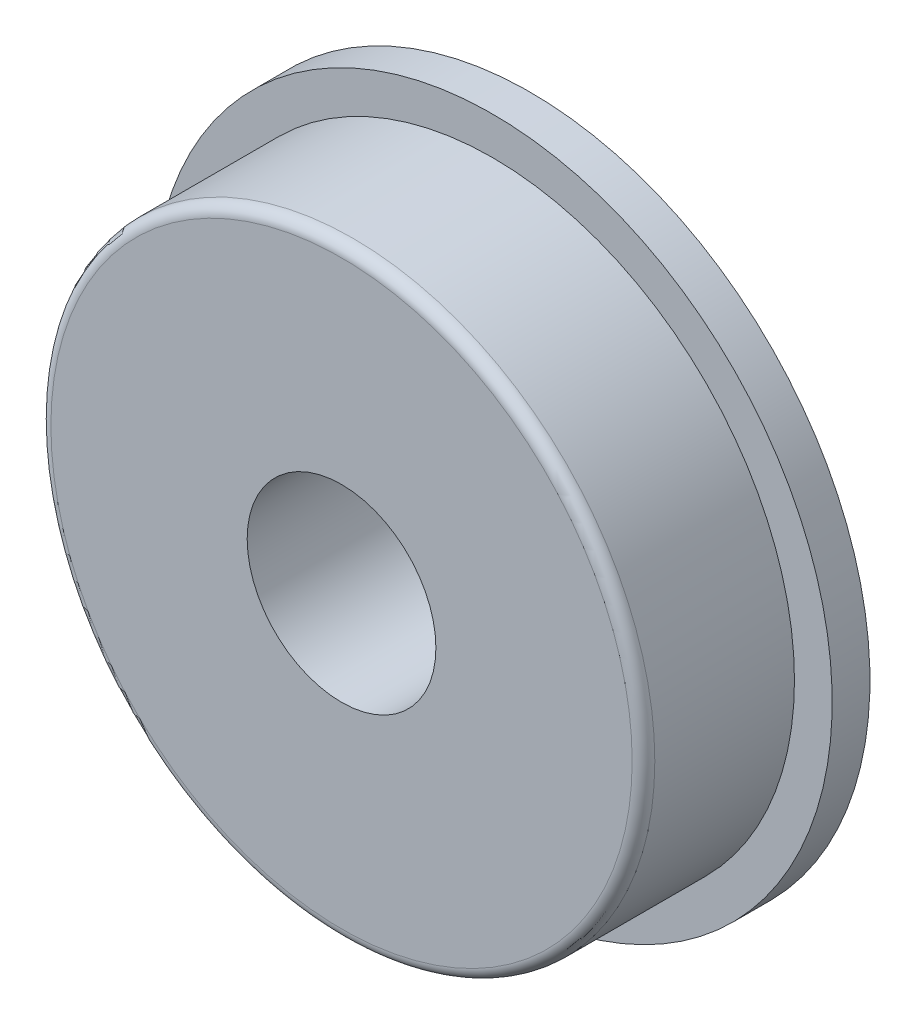
ISO-10303-21;
HEADER;
FILE_DESCRIPTION(('STEP AP214'),'2;1');
FILE_NAME('part.step','',(''),(''),'','','');
FILE_SCHEMA(('AUTOMOTIVE_DESIGN { 1 0 10303 214 1 1 1 1 }'));
ENDSEC;
DATA;
#1=APPLICATION_CONTEXT('core data for automotive mechanical design processes');
#2=APPLICATION_PROTOCOL_DEFINITION('international standard','automotive_design',2000,#1);
#3=PRODUCT_CONTEXT('',#1,'mechanical');
#4=PRODUCT('Part','Part','',(#3));
#5=PRODUCT_RELATED_PRODUCT_CATEGORY('part','',(#4));
#6=PRODUCT_DEFINITION_FORMATION('','',#4);
#7=PRODUCT_DEFINITION_CONTEXT('part definition',#1,'design');
#8=PRODUCT_DEFINITION('design','',#6,#7);
#9=PRODUCT_DEFINITION_SHAPE('','',#8);
#10=(LENGTH_UNIT() NAMED_UNIT(*) SI_UNIT(.MILLI.,.METRE.));
#11=(NAMED_UNIT(*) PLANE_ANGLE_UNIT() SI_UNIT($,.RADIAN.));
#12=(NAMED_UNIT(*) SI_UNIT($,.STERADIAN.) SOLID_ANGLE_UNIT());
#13=UNCERTAINTY_MEASURE_WITH_UNIT(LENGTH_MEASURE(1.E-05),#10,'distance_accuracy_value','');
#14=(GEOMETRIC_REPRESENTATION_CONTEXT(3) GLOBAL_UNCERTAINTY_ASSIGNED_CONTEXT((#13)) GLOBAL_UNIT_ASSIGNED_CONTEXT((#10,
#11,#12)) REPRESENTATION_CONTEXT('',''));
#15=CARTESIAN_POINT('',(0.,0.,0.));
#16=DIRECTION('',(0.,0.,1.));
#17=DIRECTION('',(1.,0.,0.));
#18=AXIS2_PLACEMENT_3D('',#15,#16,#17);
#19=CARTESIAN_POINT('',(0.,0.,4.));
#20=DIRECTION('',(0.,0.,1.));
#21=DIRECTION('',(1.,0.,0.));
#22=AXIS2_PLACEMENT_3D('',#19,#20,#21);
#23=PLANE('',#22);
#24=CARTESIAN_POINT('',(0.,0.,4.));
#25=DIRECTION('',(0.,0.,1.));
#26=DIRECTION('',(1.,0.,0.));
#27=AXIS2_PLACEMENT_3D('',#24,#25,#26);
#28=CIRCLE('',#27,7.7);
#29=CARTESIAN_POINT('',(7.7,0.,4.));
#30=VERTEX_POINT('',#29);
#31=EDGE_CURVE('E45',#30,#30,#28,.T.);
#32=ORIENTED_EDGE('',*,*,#31,.T.);
#33=EDGE_LOOP('',(#32));
#34=FACE_BOUND('',#33,.T.);
#35=CARTESIAN_POINT('',(0.,0.,4.));
#36=DIRECTION('',(0.,0.,1.));
#37=DIRECTION('',(1.,0.,0.));
#38=AXIS2_PLACEMENT_3D('',#35,#36,#37);
#39=CIRCLE('',#38,2.5);
#40=CARTESIAN_POINT('',(2.5,0.,4.));
#41=VERTEX_POINT('',#40);
#42=EDGE_CURVE('E50',#41,#41,#39,.T.);
#43=ORIENTED_EDGE('',*,*,#42,.F.);
#44=EDGE_LOOP('',(#43));
#45=FACE_BOUND('',#44,.T.);
#46=ADVANCED_FACE('F37',(#34,#45),#23,.T.);
#47=CARTESIAN_POINT('',(0.,0.,4.));
#48=DIRECTION('',(0.,0.,-1.));
#49=DIRECTION('',(-1.,0.,0.));
#50=AXIS2_PLACEMENT_3D('',#47,#48,#49);
#51=CYLINDRICAL_SURFACE('',#50,8.);
#52=CARTESIAN_POINT('',(0.,0.,3.7));
#53=DIRECTION('',(0.,0.,1.));
#54=DIRECTION('',(1.,0.,0.));
#55=AXIS2_PLACEMENT_3D('',#52,#53,#54);
#56=CIRCLE('',#55,8.);
#57=CARTESIAN_POINT('',(8.,0.,3.7));
#58=VERTEX_POINT('',#57);
#59=EDGE_CURVE('E10',#58,#58,#56,.F.);
#60=ORIENTED_EDGE('',*,*,#59,.T.);
#61=EDGE_LOOP('',(#60));
#62=FACE_BOUND('',#61,.T.);
#63=CARTESIAN_POINT('',(0.,0.,0.));
#64=DIRECTION('',(0.,0.,1.));
#65=DIRECTION('',(1.,0.,0.));
#66=AXIS2_PLACEMENT_3D('',#63,#64,#65);
#67=CIRCLE('',#66,8.);
#68=CARTESIAN_POINT('',(8.,0.,0.));
#69=VERTEX_POINT('',#68);
#70=EDGE_CURVE('E55',#69,#69,#67,.T.);
#71=ORIENTED_EDGE('',*,*,#70,.T.);
#72=EDGE_LOOP('',(#71));
#73=FACE_BOUND('',#72,.T.);
#74=ADVANCED_FACE('F88',(#62,#73),#51,.T.);
#75=CARTESIAN_POINT('',(0.,0.,4.));
#76=DIRECTION('',(0.,0.,-1.));
#77=DIRECTION('',(-1.,0.,0.));
#78=AXIS2_PLACEMENT_3D('',#75,#76,#77);
#79=CYLINDRICAL_SURFACE('',#78,2.5);
#80=ORIENTED_EDGE('',*,*,#42,.T.);
#81=EDGE_LOOP('',(#80));
#82=FACE_BOUND('',#81,.T.);
#83=CARTESIAN_POINT('',(0.,0.,-1.));
#84=DIRECTION('',(0.,0.,-1.));
#85=DIRECTION('',(-1.,0.,0.));
#86=AXIS2_PLACEMENT_3D('',#83,#84,#85);
#87=CIRCLE('',#86,2.5);
#88=CARTESIAN_POINT('',(-2.5,0.,-1.));
#89=VERTEX_POINT('',#88);
#90=EDGE_CURVE('E66',#89,#89,#87,.T.);
#91=ORIENTED_EDGE('',*,*,#90,.T.);
#92=EDGE_LOOP('',(#91));
#93=FACE_BOUND('',#92,.T.);
#94=ADVANCED_FACE('F74',(#82,#93),#79,.F.);
#95=CARTESIAN_POINT('',(0.,0.,-1.));
#96=DIRECTION('',(0.,0.,-1.));
#97=DIRECTION('',(-1.,0.,0.));
#98=AXIS2_PLACEMENT_3D('',#95,#96,#97);
#99=PLANE('',#98);
#100=CARTESIAN_POINT('',(0.,0.,-1.));
#101=DIRECTION('',(0.,0.,-1.));
#102=DIRECTION('',(-1.,0.,0.));
#103=AXIS2_PLACEMENT_3D('',#100,#101,#102);
#104=CIRCLE('',#103,9.);
#105=CARTESIAN_POINT('',(-9.,0.,-1.));
#106=VERTEX_POINT('',#105);
#107=EDGE_CURVE('E60',#106,#106,#104,.T.);
#108=ORIENTED_EDGE('',*,*,#107,.T.);
#109=EDGE_LOOP('',(#108));
#110=FACE_BOUND('',#109,.T.);
#111=ORIENTED_EDGE('',*,*,#90,.F.);
#112=EDGE_LOOP('',(#111));
#113=FACE_BOUND('',#112,.T.);
#114=ADVANCED_FACE('F76',(#110,#113),#99,.T.);
#115=CARTESIAN_POINT('',(0.,0.,0.));
#116=DIRECTION('',(0.,0.,-1.));
#117=DIRECTION('',(-1.,0.,0.));
#118=AXIS2_PLACEMENT_3D('',#115,#116,#117);
#119=PLANE('',#118);
#120=ORIENTED_EDGE('',*,*,#70,.F.);
#121=EDGE_LOOP('',(#120));
#122=FACE_BOUND('',#121,.T.);
#123=CARTESIAN_POINT('',(0.,0.,0.));
#124=DIRECTION('',(0.,0.,-1.));
#125=DIRECTION('',(-1.,0.,0.));
#126=AXIS2_PLACEMENT_3D('',#123,#124,#125);
#127=CIRCLE('',#126,9.);
#128=CARTESIAN_POINT('',(-9.,0.,0.));
#129=VERTEX_POINT('',#128);
#130=EDGE_CURVE('E62',#129,#129,#127,.T.);
#131=ORIENTED_EDGE('',*,*,#130,.F.);
#132=EDGE_LOOP('',(#131));
#133=FACE_BOUND('',#132,.T.);
#134=ADVANCED_FACE('F78',(#122,#133),#119,.F.);
#135=CARTESIAN_POINT('',(0.,0.,-1.));
#136=DIRECTION('',(0.,0.,1.));
#137=DIRECTION('',(1.,0.,0.));
#138=AXIS2_PLACEMENT_3D('',#135,#136,#137);
#139=CYLINDRICAL_SURFACE('',#138,9.);
#140=ORIENTED_EDGE('',*,*,#107,.F.);
#141=EDGE_LOOP('',(#140));
#142=FACE_BOUND('',#141,.T.);
#143=ORIENTED_EDGE('',*,*,#130,.T.);
#144=EDGE_LOOP('',(#143));
#145=FACE_BOUND('',#144,.T.);
#146=ADVANCED_FACE('F85',(#142,#145),#139,.T.);
#147=CARTESIAN_POINT('',(0.,0.,3.7));
#148=DIRECTION('',(0.,0.,1.));
#149=DIRECTION('',(1.,0.,0.));
#150=AXIS2_PLACEMENT_3D('',#147,#148,#149);
#151=TOROIDAL_SURFACE('',#150,7.7,0.3);
#152=ORIENTED_EDGE('',*,*,#59,.F.);
#153=EDGE_LOOP('',(#152));
#154=FACE_BOUND('',#153,.T.);
#155=ORIENTED_EDGE('',*,*,#31,.F.);
#156=EDGE_LOOP('',(#155));
#157=FACE_BOUND('',#156,.T.);
#158=ADVANCED_FACE('F39',(#154,#157),#151,.T.);
#159=CLOSED_SHELL('',(#46,#74,#94,#114,#134,#146,#158));
#160=MANIFOLD_SOLID_BREP('B2',#159);
#161=ADVANCED_BREP_SHAPE_REPRESENTATION('',(#18,#160),#14);
#162=SHAPE_DEFINITION_REPRESENTATION(#9,#161);
ENDSEC;
END-ISO-10303-21;
